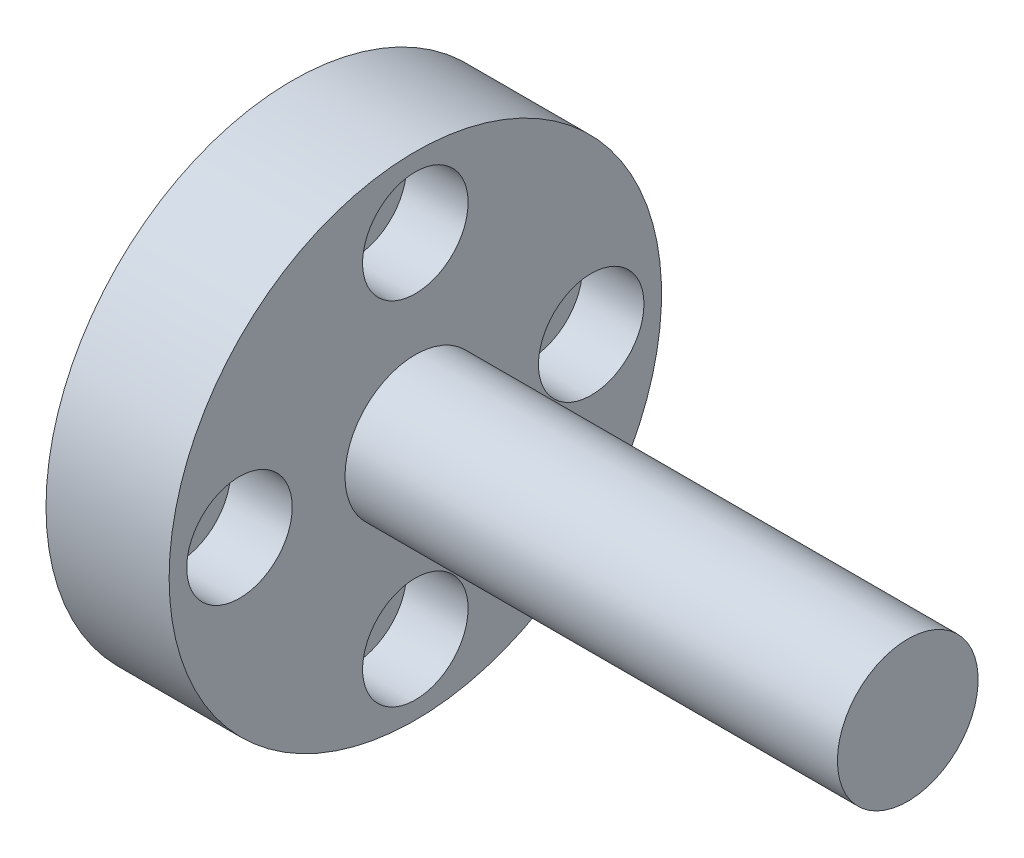
ISO-10303-21;
HEADER;
FILE_DESCRIPTION(('STEP AP214'),'2;1');
FILE_NAME('part.step','',(''),(''),'','','');
FILE_SCHEMA(('AUTOMOTIVE_DESIGN { 1 0 10303 214 1 1 1 1 }'));
ENDSEC;
DATA;
#1=APPLICATION_CONTEXT('core data for automotive mechanical design processes');
#2=APPLICATION_PROTOCOL_DEFINITION('international standard','automotive_design',2000,#1);
#3=PRODUCT_CONTEXT('',#1,'mechanical');
#4=PRODUCT('Part','Part','',(#3));
#5=PRODUCT_RELATED_PRODUCT_CATEGORY('part','',(#4));
#6=PRODUCT_DEFINITION_FORMATION('','',#4);
#7=PRODUCT_DEFINITION_CONTEXT('part definition',#1,'design');
#8=PRODUCT_DEFINITION('design','',#6,#7);
#9=PRODUCT_DEFINITION_SHAPE('','',#8);
#10=(LENGTH_UNIT() NAMED_UNIT(*) SI_UNIT(.MILLI.,.METRE.));
#11=(NAMED_UNIT(*) PLANE_ANGLE_UNIT() SI_UNIT($,.RADIAN.));
#12=(NAMED_UNIT(*) SI_UNIT($,.STERADIAN.) SOLID_ANGLE_UNIT());
#13=UNCERTAINTY_MEASURE_WITH_UNIT(LENGTH_MEASURE(1.E-05),#10,'distance_accuracy_value','');
#14=(GEOMETRIC_REPRESENTATION_CONTEXT(3) GLOBAL_UNCERTAINTY_ASSIGNED_CONTEXT((#13)) GLOBAL_UNIT_ASSIGNED_CONTEXT((#10,
#11,#12)) REPRESENTATION_CONTEXT('',''));
#15=CARTESIAN_POINT('',(0.,0.,0.));
#16=DIRECTION('',(0.,0.,1.));
#17=DIRECTION('',(1.,0.,0.));
#18=AXIS2_PLACEMENT_3D('',#15,#16,#17);
#19=CARTESIAN_POINT('',(0.,0.,0.));
#20=DIRECTION('',(-1.,0.,0.));
#21=DIRECTION('',(0.,0.,1.));
#22=AXIS2_PLACEMENT_3D('',#19,#20,#21);
#23=PLANE('',#22);
#24=CARTESIAN_POINT('',(0.,0.,0.));
#25=DIRECTION('',(-1.,0.,0.));
#26=DIRECTION('',(0.,0.,1.));
#27=AXIS2_PLACEMENT_3D('',#24,#25,#26);
#28=CIRCLE('',#27,2.5);
#29=CARTESIAN_POINT('',(0.,0.,2.5));
#30=VERTEX_POINT('',#29);
#31=EDGE_CURVE('E105',#30,#30,#28,.T.);
#32=ORIENTED_EDGE('',*,*,#31,.F.);
#33=EDGE_LOOP('',(#32));
#34=FACE_BOUND('',#33,.T.);
#35=CARTESIAN_POINT('',(0.,10.,-1.04744440165294E-13));
#36=DIRECTION('',(1.,0.,0.));
#37=DIRECTION('',(0.,0.,-1.));
#38=AXIS2_PLACEMENT_3D('',#35,#36,#37);
#39=CIRCLE('',#38,1.6);
#40=CARTESIAN_POINT('',(0.,10.,-1.6000000000001));
#41=VERTEX_POINT('',#40);
#42=EDGE_CURVE('E92',#41,#41,#39,.T.);
#43=ORIENTED_EDGE('',*,*,#42,.T.);
#44=EDGE_LOOP('',(#43));
#45=FACE_BOUND('',#44,.T.);
#46=CARTESIAN_POINT('',(0.,0.,10.));
#47=DIRECTION('',(1.,0.,0.));
#48=DIRECTION('',(0.,0.,-1.));
#49=AXIS2_PLACEMENT_3D('',#46,#47,#48);
#50=CIRCLE('',#49,1.6);
#51=CARTESIAN_POINT('',(0.,0.,8.4));
#52=VERTEX_POINT('',#51);
#53=EDGE_CURVE('E80',#52,#52,#50,.T.);
#54=ORIENTED_EDGE('',*,*,#53,.T.);
#55=EDGE_LOOP('',(#54));
#56=FACE_BOUND('',#55,.T.);
#57=CARTESIAN_POINT('',(0.,-10.,0.));
#58=DIRECTION('',(1.,0.,0.));
#59=DIRECTION('',(0.,0.,-1.));
#60=AXIS2_PLACEMENT_3D('',#57,#58,#59);
#61=CIRCLE('',#60,1.6);
#62=CARTESIAN_POINT('',(0.,-10.,-1.59999999999996));
#63=VERTEX_POINT('',#62);
#64=EDGE_CURVE('E68',#63,#63,#61,.T.);
#65=ORIENTED_EDGE('',*,*,#64,.T.);
#66=EDGE_LOOP('',(#65));
#67=FACE_BOUND('',#66,.T.);
#68=CARTESIAN_POINT('',(0.,0.,-10.));
#69=DIRECTION('',(1.,0.,0.));
#70=DIRECTION('',(0.,0.,-1.));
#71=AXIS2_PLACEMENT_3D('',#68,#69,#70);
#72=CIRCLE('',#71,1.6);
#73=CARTESIAN_POINT('',(0.,0.,-11.6));
#74=VERTEX_POINT('',#73);
#75=EDGE_CURVE('E56',#74,#74,#72,.T.);
#76=ORIENTED_EDGE('',*,*,#75,.T.);
#77=EDGE_LOOP('',(#76));
#78=FACE_BOUND('',#77,.T.);
#79=CARTESIAN_POINT('',(0.,0.,0.));
#80=DIRECTION('',(-1.,0.,0.));
#81=DIRECTION('',(0.,0.,1.));
#82=AXIS2_PLACEMENT_3D('',#79,#80,#81);
#83=CIRCLE('',#82,14.);
#84=CARTESIAN_POINT('',(0.,0.,14.));
#85=VERTEX_POINT('',#84);
#86=EDGE_CURVE('E51',#85,#85,#83,.T.);
#87=ORIENTED_EDGE('',*,*,#86,.T.);
#88=EDGE_LOOP('',(#87));
#89=FACE_BOUND('',#88,.T.);
#90=ADVANCED_FACE('F37',(#34,#45,#56,#67,#78,#89),#23,.T.);
#91=CARTESIAN_POINT('',(35.,0.,0.));
#92=DIRECTION('',(1.,0.,0.));
#93=DIRECTION('',(0.,0.,-1.));
#94=AXIS2_PLACEMENT_3D('',#91,#92,#93);
#95=PLANE('',#94);
#96=CARTESIAN_POINT('',(35.,0.,0.));
#97=DIRECTION('',(-1.,0.,0.));
#98=DIRECTION('',(0.,0.,1.));
#99=AXIS2_PLACEMENT_3D('',#96,#97,#98);
#100=CIRCLE('',#99,4.);
#101=CARTESIAN_POINT('',(35.,0.,4.));
#102=VERTEX_POINT('',#101);
#103=EDGE_CURVE('E10',#102,#102,#100,.T.);
#104=ORIENTED_EDGE('',*,*,#103,.F.);
#105=EDGE_LOOP('',(#104));
#106=FACE_BOUND('',#105,.T.);
#107=ADVANCED_FACE('F122',(#106),#95,.T.);
#108=CARTESIAN_POINT('',(0.,0.,0.));
#109=DIRECTION('',(-1.,0.,0.));
#110=DIRECTION('',(0.,0.,1.));
#111=AXIS2_PLACEMENT_3D('',#108,#109,#110);
#112=CYLINDRICAL_SURFACE('',#111,4.);
#113=ORIENTED_EDGE('',*,*,#103,.T.);
#114=EDGE_LOOP('',(#113));
#115=FACE_BOUND('',#114,.T.);
#116=CARTESIAN_POINT('',(7.,0.,0.));
#117=DIRECTION('',(-1.,0.,0.));
#118=DIRECTION('',(0.,0.,1.));
#119=AXIS2_PLACEMENT_3D('',#116,#117,#118);
#120=CIRCLE('',#119,4.);
#121=CARTESIAN_POINT('',(7.,0.,4.));
#122=VERTEX_POINT('',#121);
#123=EDGE_CURVE('E43',#122,#122,#120,.T.);
#124=ORIENTED_EDGE('',*,*,#123,.F.);
#125=EDGE_LOOP('',(#124));
#126=FACE_BOUND('',#125,.T.);
#127=ADVANCED_FACE('F147',(#115,#126),#112,.T.);
#128=CARTESIAN_POINT('',(7.,0.,0.));
#129=DIRECTION('',(1.,0.,0.));
#130=DIRECTION('',(0.,0.,-1.));
#131=AXIS2_PLACEMENT_3D('',#128,#129,#130);
#132=PLANE('',#131);
#133=CARTESIAN_POINT('',(7.,10.,-1.04744440165294E-13));
#134=DIRECTION('',(1.,0.,0.));
#135=DIRECTION('',(0.,0.,-1.));
#136=AXIS2_PLACEMENT_3D('',#133,#134,#135);
#137=CIRCLE('',#136,3.);
#138=CARTESIAN_POINT('',(7.,10.,-3.00000000000011));
#139=VERTEX_POINT('',#138);
#140=EDGE_CURVE('E101',#139,#139,#137,.T.);
#141=ORIENTED_EDGE('',*,*,#140,.F.);
#142=EDGE_LOOP('',(#141));
#143=FACE_BOUND('',#142,.T.);
#144=CARTESIAN_POINT('',(7.,0.,10.));
#145=DIRECTION('',(1.,0.,0.));
#146=DIRECTION('',(0.,0.,-1.));
#147=AXIS2_PLACEMENT_3D('',#144,#145,#146);
#148=CIRCLE('',#147,3.);
#149=CARTESIAN_POINT('',(7.,0.,7.));
#150=VERTEX_POINT('',#149);
#151=EDGE_CURVE('E89',#150,#150,#148,.T.);
#152=ORIENTED_EDGE('',*,*,#151,.F.);
#153=EDGE_LOOP('',(#152));
#154=FACE_BOUND('',#153,.T.);
#155=CARTESIAN_POINT('',(7.,-10.,0.));
#156=DIRECTION('',(1.,0.,0.));
#157=DIRECTION('',(0.,0.,-1.));
#158=AXIS2_PLACEMENT_3D('',#155,#156,#157);
#159=CIRCLE('',#158,3.);
#160=CARTESIAN_POINT('',(7.,-10.,-2.99999999999996));
#161=VERTEX_POINT('',#160);
#162=EDGE_CURVE('E77',#161,#161,#159,.T.);
#163=ORIENTED_EDGE('',*,*,#162,.F.);
#164=EDGE_LOOP('',(#163));
#165=FACE_BOUND('',#164,.T.);
#166=CARTESIAN_POINT('',(7.,0.,-10.));
#167=DIRECTION('',(1.,0.,0.));
#168=DIRECTION('',(0.,0.,-1.));
#169=AXIS2_PLACEMENT_3D('',#166,#167,#168);
#170=CIRCLE('',#169,3.);
#171=CARTESIAN_POINT('',(7.,0.,-13.));
#172=VERTEX_POINT('',#171);
#173=EDGE_CURVE('E65',#172,#172,#170,.T.);
#174=ORIENTED_EDGE('',*,*,#173,.F.);
#175=EDGE_LOOP('',(#174));
#176=FACE_BOUND('',#175,.T.);
#177=ORIENTED_EDGE('',*,*,#123,.T.);
#178=EDGE_LOOP('',(#177));
#179=FACE_BOUND('',#178,.T.);
#180=CARTESIAN_POINT('',(7.,0.,0.));
#181=DIRECTION('',(-1.,0.,0.));
#182=DIRECTION('',(0.,0.,1.));
#183=AXIS2_PLACEMENT_3D('',#180,#181,#182);
#184=CIRCLE('',#183,14.);
#185=CARTESIAN_POINT('',(7.,0.,14.));
#186=VERTEX_POINT('',#185);
#187=EDGE_CURVE('E47',#186,#186,#184,.T.);
#188=ORIENTED_EDGE('',*,*,#187,.F.);
#189=EDGE_LOOP('',(#188));
#190=FACE_BOUND('',#189,.T.);
#191=ADVANCED_FACE('F136',(#143,#154,#165,#176,#179,#190),#132,.T.);
#192=CARTESIAN_POINT('',(0.,0.,0.));
#193=DIRECTION('',(-1.,0.,0.));
#194=DIRECTION('',(0.,0.,1.));
#195=AXIS2_PLACEMENT_3D('',#192,#193,#194);
#196=CYLINDRICAL_SURFACE('',#195,14.);
#197=ORIENTED_EDGE('',*,*,#187,.T.);
#198=EDGE_LOOP('',(#197));
#199=FACE_BOUND('',#198,.T.);
#200=ORIENTED_EDGE('',*,*,#86,.F.);
#201=EDGE_LOOP('',(#200));
#202=FACE_BOUND('',#201,.T.);
#203=ADVANCED_FACE('F133',(#199,#202),#196,.T.);
#204=CARTESIAN_POINT('',(7.,0.,-10.));
#205=DIRECTION('',(1.,0.,0.));
#206=DIRECTION('',(0.,0.,-1.));
#207=AXIS2_PLACEMENT_3D('',#204,#205,#206);
#208=CYLINDRICAL_SURFACE('',#207,1.6);
#209=ORIENTED_EDGE('',*,*,#75,.F.);
#210=EDGE_LOOP('',(#209));
#211=FACE_BOUND('',#210,.T.);
#212=CARTESIAN_POINT('',(3.5,0.,-10.));
#213=DIRECTION('',(1.,0.,0.));
#214=DIRECTION('',(0.,0.,-1.));
#215=AXIS2_PLACEMENT_3D('',#212,#213,#214);
#216=CIRCLE('',#215,1.6);
#217=CARTESIAN_POINT('',(3.5,0.,-11.6));
#218=VERTEX_POINT('',#217);
#219=EDGE_CURVE('E59',#218,#218,#216,.T.);
#220=ORIENTED_EDGE('',*,*,#219,.T.);
#221=EDGE_LOOP('',(#220));
#222=FACE_BOUND('',#221,.T.);
#223=ADVANCED_FACE('F135',(#211,#222),#208,.F.);
#224=CARTESIAN_POINT('',(3.5,1.6,-10.));
#225=DIRECTION('',(-1.,0.,0.));
#226=DIRECTION('',(0.,0.,1.));
#227=AXIS2_PLACEMENT_3D('',#224,#225,#226);
#228=PLANE('',#227);
#229=ORIENTED_EDGE('',*,*,#219,.F.);
#230=EDGE_LOOP('',(#229));
#231=FACE_BOUND('',#230,.T.);
#232=CARTESIAN_POINT('',(3.5,0.,-10.));
#233=DIRECTION('',(1.,0.,0.));
#234=DIRECTION('',(0.,0.,-1.));
#235=AXIS2_PLACEMENT_3D('',#232,#233,#234);
#236=CIRCLE('',#235,3.);
#237=CARTESIAN_POINT('',(3.5,0.,-13.));
#238=VERTEX_POINT('',#237);
#239=EDGE_CURVE('E62',#238,#238,#236,.T.);
#240=ORIENTED_EDGE('',*,*,#239,.T.);
#241=EDGE_LOOP('',(#240));
#242=FACE_BOUND('',#241,.T.);
#243=ADVANCED_FACE('F143',(#231,#242),#228,.F.);
#244=CARTESIAN_POINT('',(7.,0.,-10.));
#245=DIRECTION('',(1.,0.,0.));
#246=DIRECTION('',(0.,0.,-1.));
#247=AXIS2_PLACEMENT_3D('',#244,#245,#246);
#248=CYLINDRICAL_SURFACE('',#247,3.);
#249=ORIENTED_EDGE('',*,*,#239,.F.);
#250=EDGE_LOOP('',(#249));
#251=FACE_BOUND('',#250,.T.);
#252=ORIENTED_EDGE('',*,*,#173,.T.);
#253=EDGE_LOOP('',(#252));
#254=FACE_BOUND('',#253,.T.);
#255=ADVANCED_FACE('F190',(#251,#254),#248,.F.);
#256=CARTESIAN_POINT('',(7.,-10.,0.));
#257=DIRECTION('',(1.,0.,0.));
#258=DIRECTION('',(0.,0.,-1.));
#259=AXIS2_PLACEMENT_3D('',#256,#257,#258);
#260=CYLINDRICAL_SURFACE('',#259,1.6);
#261=ORIENTED_EDGE('',*,*,#64,.F.);
#262=EDGE_LOOP('',(#261));
#263=FACE_BOUND('',#262,.T.);
#264=CARTESIAN_POINT('',(3.5,-10.,0.));
#265=DIRECTION('',(1.,0.,0.));
#266=DIRECTION('',(0.,0.,-1.));
#267=AXIS2_PLACEMENT_3D('',#264,#265,#266);
#268=CIRCLE('',#267,1.6);
#269=CARTESIAN_POINT('',(3.5,-10.,-1.59999999999996));
#270=VERTEX_POINT('',#269);
#271=EDGE_CURVE('E71',#270,#270,#268,.T.);
#272=ORIENTED_EDGE('',*,*,#271,.T.);
#273=EDGE_LOOP('',(#272));
#274=FACE_BOUND('',#273,.T.);
#275=ADVANCED_FACE('F198',(#263,#274),#260,.F.);
#276=CARTESIAN_POINT('',(3.5,-8.4,0.));
#277=DIRECTION('',(-1.,0.,0.));
#278=DIRECTION('',(0.,0.,1.));
#279=AXIS2_PLACEMENT_3D('',#276,#277,#278);
#280=PLANE('',#279);
#281=ORIENTED_EDGE('',*,*,#271,.F.);
#282=EDGE_LOOP('',(#281));
#283=FACE_BOUND('',#282,.T.);
#284=CARTESIAN_POINT('',(3.5,-10.,0.));
#285=DIRECTION('',(1.,0.,0.));
#286=DIRECTION('',(0.,0.,-1.));
#287=AXIS2_PLACEMENT_3D('',#284,#285,#286);
#288=CIRCLE('',#287,3.);
#289=CARTESIAN_POINT('',(3.5,-10.,-2.99999999999996));
#290=VERTEX_POINT('',#289);
#291=EDGE_CURVE('E74',#290,#290,#288,.T.);
#292=ORIENTED_EDGE('',*,*,#291,.T.);
#293=EDGE_LOOP('',(#292));
#294=FACE_BOUND('',#293,.T.);
#295=ADVANCED_FACE('F207',(#283,#294),#280,.F.);
#296=CARTESIAN_POINT('',(7.,-10.,0.));
#297=DIRECTION('',(1.,0.,0.));
#298=DIRECTION('',(0.,0.,-1.));
#299=AXIS2_PLACEMENT_3D('',#296,#297,#298);
#300=CYLINDRICAL_SURFACE('',#299,3.);
#301=ORIENTED_EDGE('',*,*,#291,.F.);
#302=EDGE_LOOP('',(#301));
#303=FACE_BOUND('',#302,.T.);
#304=ORIENTED_EDGE('',*,*,#162,.T.);
#305=EDGE_LOOP('',(#304));
#306=FACE_BOUND('',#305,.T.);
#307=ADVANCED_FACE('F217',(#303,#306),#300,.F.);
#308=CARTESIAN_POINT('',(7.,0.,10.));
#309=DIRECTION('',(1.,0.,0.));
#310=DIRECTION('',(0.,0.,-1.));
#311=AXIS2_PLACEMENT_3D('',#308,#309,#310);
#312=CYLINDRICAL_SURFACE('',#311,1.6);
#313=ORIENTED_EDGE('',*,*,#53,.F.);
#314=EDGE_LOOP('',(#313));
#315=FACE_BOUND('',#314,.T.);
#316=CARTESIAN_POINT('',(3.5,0.,10.));
#317=DIRECTION('',(1.,0.,0.));
#318=DIRECTION('',(0.,0.,-1.));
#319=AXIS2_PLACEMENT_3D('',#316,#317,#318);
#320=CIRCLE('',#319,1.6);
#321=CARTESIAN_POINT('',(3.5,0.,8.4));
#322=VERTEX_POINT('',#321);
#323=EDGE_CURVE('E83',#322,#322,#320,.T.);
#324=ORIENTED_EDGE('',*,*,#323,.T.);
#325=EDGE_LOOP('',(#324));
#326=FACE_BOUND('',#325,.T.);
#327=ADVANCED_FACE('F227',(#315,#326),#312,.F.);
#328=CARTESIAN_POINT('',(3.5,1.6,10.));
#329=DIRECTION('',(-1.,0.,0.));
#330=DIRECTION('',(0.,0.,1.));
#331=AXIS2_PLACEMENT_3D('',#328,#329,#330);
#332=PLANE('',#331);
#333=ORIENTED_EDGE('',*,*,#323,.F.);
#334=EDGE_LOOP('',(#333));
#335=FACE_BOUND('',#334,.T.);
#336=CARTESIAN_POINT('',(3.5,0.,10.));
#337=DIRECTION('',(1.,0.,0.));
#338=DIRECTION('',(0.,0.,-1.));
#339=AXIS2_PLACEMENT_3D('',#336,#337,#338);
#340=CIRCLE('',#339,3.);
#341=CARTESIAN_POINT('',(3.5,0.,7.));
#342=VERTEX_POINT('',#341);
#343=EDGE_CURVE('E86',#342,#342,#340,.T.);
#344=ORIENTED_EDGE('',*,*,#343,.T.);
#345=EDGE_LOOP('',(#344));
#346=FACE_BOUND('',#345,.T.);
#347=ADVANCED_FACE('F237',(#335,#346),#332,.F.);
#348=CARTESIAN_POINT('',(7.,0.,10.));
#349=DIRECTION('',(1.,0.,0.));
#350=DIRECTION('',(0.,0.,-1.));
#351=AXIS2_PLACEMENT_3D('',#348,#349,#350);
#352=CYLINDRICAL_SURFACE('',#351,3.);
#353=ORIENTED_EDGE('',*,*,#343,.F.);
#354=EDGE_LOOP('',(#353));
#355=FACE_BOUND('',#354,.T.);
#356=ORIENTED_EDGE('',*,*,#151,.T.);
#357=EDGE_LOOP('',(#356));
#358=FACE_BOUND('',#357,.T.);
#359=ADVANCED_FACE('F247',(#355,#358),#352,.F.);
#360=CARTESIAN_POINT('',(7.,10.,-1.04744440165294E-13));
#361=DIRECTION('',(1.,0.,0.));
#362=DIRECTION('',(0.,0.,-1.));
#363=AXIS2_PLACEMENT_3D('',#360,#361,#362);
#364=CYLINDRICAL_SURFACE('',#363,1.6);
#365=ORIENTED_EDGE('',*,*,#42,.F.);
#366=EDGE_LOOP('',(#365));
#367=FACE_BOUND('',#366,.T.);
#368=CARTESIAN_POINT('',(3.5,10.,-1.04744440165294E-13));
#369=DIRECTION('',(1.,0.,0.));
#370=DIRECTION('',(0.,0.,-1.));
#371=AXIS2_PLACEMENT_3D('',#368,#369,#370);
#372=CIRCLE('',#371,1.6);
#373=CARTESIAN_POINT('',(3.5,10.,-1.6000000000001));
#374=VERTEX_POINT('',#373);
#375=EDGE_CURVE('E95',#374,#374,#372,.T.);
#376=ORIENTED_EDGE('',*,*,#375,.T.);
#377=EDGE_LOOP('',(#376));
#378=FACE_BOUND('',#377,.T.);
#379=ADVANCED_FACE('F257',(#367,#378),#364,.F.);
#380=CARTESIAN_POINT('',(3.5,11.6,-1.04744440165294E-13));
#381=DIRECTION('',(-1.,0.,0.));
#382=DIRECTION('',(0.,0.,1.));
#383=AXIS2_PLACEMENT_3D('',#380,#381,#382);
#384=PLANE('',#383);
#385=ORIENTED_EDGE('',*,*,#375,.F.);
#386=EDGE_LOOP('',(#385));
#387=FACE_BOUND('',#386,.T.);
#388=CARTESIAN_POINT('',(3.5,10.,-1.04744440165294E-13));
#389=DIRECTION('',(1.,0.,0.));
#390=DIRECTION('',(0.,0.,-1.));
#391=AXIS2_PLACEMENT_3D('',#388,#389,#390);
#392=CIRCLE('',#391,3.);
#393=CARTESIAN_POINT('',(3.5,10.,-3.00000000000011));
#394=VERTEX_POINT('',#393);
#395=EDGE_CURVE('E98',#394,#394,#392,.T.);
#396=ORIENTED_EDGE('',*,*,#395,.T.);
#397=EDGE_LOOP('',(#396));
#398=FACE_BOUND('',#397,.T.);
#399=ADVANCED_FACE('F267',(#387,#398),#384,.F.);
#400=CARTESIAN_POINT('',(7.,10.,-1.04744440165294E-13));
#401=DIRECTION('',(1.,0.,0.));
#402=DIRECTION('',(0.,0.,-1.));
#403=AXIS2_PLACEMENT_3D('',#400,#401,#402);
#404=CYLINDRICAL_SURFACE('',#403,3.);
#405=ORIENTED_EDGE('',*,*,#395,.F.);
#406=EDGE_LOOP('',(#405));
#407=FACE_BOUND('',#406,.T.);
#408=ORIENTED_EDGE('',*,*,#140,.T.);
#409=EDGE_LOOP('',(#408));
#410=FACE_BOUND('',#409,.T.);
#411=ADVANCED_FACE('F116',(#407,#410),#404,.F.);
#412=CARTESIAN_POINT('',(2.,0.,0.));
#413=DIRECTION('',(-1.,0.,0.));
#414=DIRECTION('',(0.,0.,1.));
#415=AXIS2_PLACEMENT_3D('',#412,#413,#414);
#416=CYLINDRICAL_SURFACE('',#415,2.5);
#417=CARTESIAN_POINT('',(2.,0.,0.));
#418=DIRECTION('',(-1.,0.,0.));
#419=DIRECTION('',(0.,0.,1.));
#420=AXIS2_PLACEMENT_3D('',#417,#418,#419);
#421=CIRCLE('',#420,2.5);
#422=CARTESIAN_POINT('',(2.,0.,2.5));
#423=VERTEX_POINT('',#422);
#424=EDGE_CURVE('E104',#423,#423,#421,.T.);
#425=ORIENTED_EDGE('',*,*,#424,.F.);
#426=EDGE_LOOP('',(#425));
#427=FACE_BOUND('',#426,.T.);
#428=ORIENTED_EDGE('',*,*,#31,.T.);
#429=EDGE_LOOP('',(#428));
#430=FACE_BOUND('',#429,.T.);
#431=ADVANCED_FACE('F113',(#427,#430),#416,.F.);
#432=CARTESIAN_POINT('',(2.,0.,0.));
#433=DIRECTION('',(-1.,0.,0.));
#434=DIRECTION('',(0.,0.,1.));
#435=AXIS2_PLACEMENT_3D('',#432,#433,#434);
#436=PLANE('',#435);
#437=ORIENTED_EDGE('',*,*,#424,.T.);
#438=EDGE_LOOP('',(#437));
#439=FACE_BOUND('',#438,.T.);
#440=ADVANCED_FACE('F111',(#439),#436,.T.);
#441=CLOSED_SHELL('',(#90,#107,#127,#191,#203,#223,#243,#255,#275,#295,#307,#327,#347,#359,#379,
#399,#411,#431,#440));
#442=MANIFOLD_SOLID_BREP('B2',#441);
#443=ADVANCED_BREP_SHAPE_REPRESENTATION('',(#18,#442),#14);
#444=SHAPE_DEFINITION_REPRESENTATION(#9,#443);
ENDSEC;
END-ISO-10303-21;
